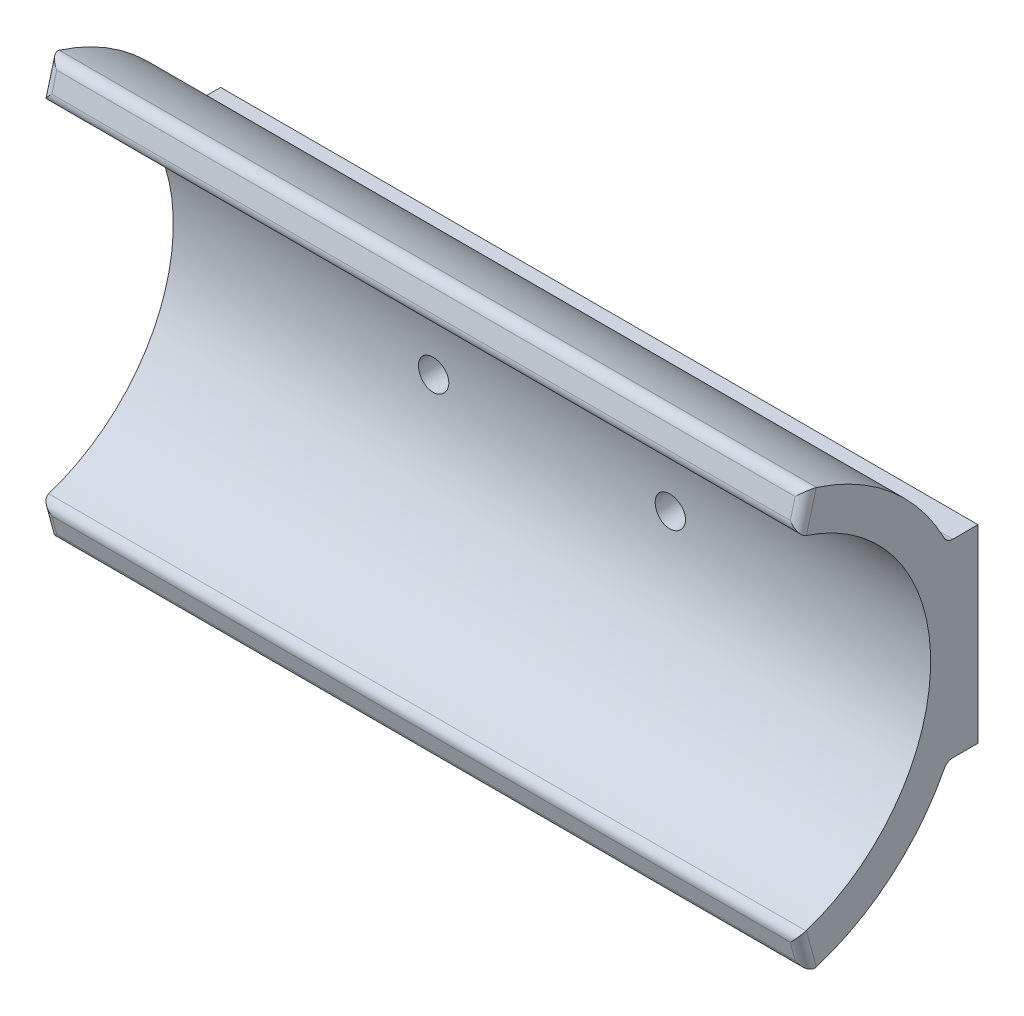
ISO-10303-21;
HEADER;
FILE_DESCRIPTION(('STEP AP214'),'2;1');
FILE_NAME('part.step','',(''),(''),'','','');
FILE_SCHEMA(('AUTOMOTIVE_DESIGN { 1 0 10303 214 1 1 1 1 }'));
ENDSEC;
DATA;
#1=APPLICATION_CONTEXT('core data for automotive mechanical design processes');
#2=APPLICATION_PROTOCOL_DEFINITION('international standard','automotive_design',2000,#1);
#3=PRODUCT_CONTEXT('',#1,'mechanical');
#4=PRODUCT('Part','Part','',(#3));
#5=PRODUCT_RELATED_PRODUCT_CATEGORY('part','',(#4));
#6=PRODUCT_DEFINITION_FORMATION('','',#4);
#7=PRODUCT_DEFINITION_CONTEXT('part definition',#1,'design');
#8=PRODUCT_DEFINITION('design','',#6,#7);
#9=PRODUCT_DEFINITION_SHAPE('','',#8);
#10=(LENGTH_UNIT() NAMED_UNIT(*) SI_UNIT(.MILLI.,.METRE.));
#11=(NAMED_UNIT(*) PLANE_ANGLE_UNIT() SI_UNIT($,.RADIAN.));
#12=(NAMED_UNIT(*) SI_UNIT($,.STERADIAN.) SOLID_ANGLE_UNIT());
#13=UNCERTAINTY_MEASURE_WITH_UNIT(LENGTH_MEASURE(1.E-05),#10,'distance_accuracy_value','');
#14=(GEOMETRIC_REPRESENTATION_CONTEXT(3) GLOBAL_UNCERTAINTY_ASSIGNED_CONTEXT((#13)) GLOBAL_UNIT_ASSIGNED_CONTEXT((#10,
#11,#12)) REPRESENTATION_CONTEXT('',''));
#15=CARTESIAN_POINT('',(0.,0.,0.));
#16=DIRECTION('',(0.,0.,1.));
#17=DIRECTION('',(1.,0.,0.));
#18=AXIS2_PLACEMENT_3D('',#15,#16,#17);
#19=CARTESIAN_POINT('',(40.,0.,0.));
#20=DIRECTION('',(-1.,0.,0.));
#21=DIRECTION('',(0.,0.,1.));
#22=AXIS2_PLACEMENT_3D('',#19,#20,#21);
#23=CYLINDRICAL_SURFACE('',#22,19.);
#24=CARTESIAN_POINT('',(-14.1,0.,-19.));
#25=CARTESIAN_POINT('',(-14.0999960835415,0.0897022201628079,-18.9999991180376));
#26=CARTESIAN_POINT('',(-14.0924310417876,0.17946542118437,-18.9993579799411));
#27=CARTESIAN_POINT('',(-14.062364118635,0.356508015860384,-18.9968619968672));
#28=CARTESIAN_POINT('',(-14.0398453372965,0.443784482616437,-18.9950057787034));
#29=CARTESIAN_POINT('',(-13.9805269531569,0.613263876432167,-18.9902893862354));
#30=CARTESIAN_POINT('',(-13.9437354570041,0.695469652889491,-18.9874297819246));
#31=CARTESIAN_POINT('',(-13.8569305817379,0.852519280905819,-18.9810272614847));
#32=CARTESIAN_POINT('',(-13.8069200212426,0.927364697205886,-18.9774844910664));
#33=CARTESIAN_POINT('',(-13.694956297622,1.06778314835982,-18.9701028517491));
#34=CARTESIAN_POINT('',(-13.6329758716362,1.13333441200539,-18.9662633191453));
#35=CARTESIAN_POINT('',(-13.4988894451914,1.25311698514063,-18.9587264598766));
#36=CARTESIAN_POINT('',(-13.4267829990441,1.30734779610871,-18.9550291394802));
#37=CARTESIAN_POINT('',(-13.2743593194736,1.4030239180965,-18.9481882068375));
#38=CARTESIAN_POINT('',(-13.1940300165727,1.44445006562922,-18.945045427506));
#39=CARTESIAN_POINT('',(-13.0275249701652,1.51321851188047,-18.9396770420494));
#40=CARTESIAN_POINT('',(-12.9413493319264,1.5405610641091,-18.9374514194152));
#41=CARTESIAN_POINT('',(-12.7658161651597,1.5803229462556,-18.9341749382671));
#42=CARTESIAN_POINT('',(-12.6764667317365,1.59277777884827,-18.9331212853813));
#43=CARTESIAN_POINT('',(-12.4969398154057,1.60252035582066,-18.9322992173065));
#44=CARTESIAN_POINT('',(-12.4067623483701,1.59980839031896,-18.9325307775332));
#45=CARTESIAN_POINT('',(-12.2283825401598,1.57932369237232,-18.9342504325839));
#46=CARTESIAN_POINT('',(-12.140175731652,1.56158955316633,-18.9357353075014));
#47=CARTESIAN_POINT('',(-11.9679951319775,1.51162387767854,-18.9397892330275));
#48=CARTESIAN_POINT('',(-11.8840213829297,1.47939219717754,-18.9423582944214));
#49=CARTESIAN_POINT('',(-11.7225676731866,1.40130319713967,-18.9482948277938));
#50=CARTESIAN_POINT('',(-11.6450961213911,1.35542857182675,-18.9516633127206));
#51=CARTESIAN_POINT('',(-11.498937900689,1.25136836863842,-18.9588182157182));
#52=CARTESIAN_POINT('',(-11.4302514135627,1.19318253608593,-18.9626046424339));
#53=CARTESIAN_POINT('',(-11.3033886861831,1.06593518539138,-18.970183115644));
#54=CARTESIAN_POINT('',(-11.2452459034404,0.996840304475862,-18.9739751428185));
#55=CARTESIAN_POINT('',(-11.1413797628512,0.849852575218629,-18.9811262983821));
#56=CARTESIAN_POINT('',(-11.0956564135354,0.771959720833711,-18.9844854264737));
#57=CARTESIAN_POINT('',(-11.0179291052771,0.609565321587298,-18.9903929611599));
#58=CARTESIAN_POINT('',(-10.9859266385501,0.525063059100258,-18.9929412795669));
#59=CARTESIAN_POINT('',(-10.936573006044,0.351858580781858,-18.9969390629498));
#60=CARTESIAN_POINT('',(-10.9192215297571,0.263156454003024,-18.9983885512137));
#61=CARTESIAN_POINT('',(-10.8997043948967,0.0843601672939649,-19.0000223666535));
#62=CARTESIAN_POINT('',(-10.8974925249959,-0.00572891460424725,-19.0002105437517));
#63=CARTESIAN_POINT('',(-10.9081963170893,-0.184996611802441,-18.9993108186761));
#64=CARTESIAN_POINT('',(-10.9211118349468,-0.274175235769281,-18.9982229286608));
#65=CARTESIAN_POINT('',(-10.9616654752258,-0.448958720175844,-18.9948958862545));
#66=CARTESIAN_POINT('',(-10.9892821675597,-0.534568587461511,-18.992658409795));
#67=CARTESIAN_POINT('',(-11.0584323252729,-0.699939526801056,-18.9872835295732));
#68=CARTESIAN_POINT('',(-11.099966015183,-0.779700504466144,-18.9841461112917));
#69=CARTESIAN_POINT('',(-11.1958872343935,-0.931319775497864,-18.9773134190734));
#70=CARTESIAN_POINT('',(-11.2503053656597,-1.00315864824649,-18.9736168246983));
#71=CARTESIAN_POINT('',(-11.3704065463115,-1.13669840169253,-18.9660854910945));
#72=CARTESIAN_POINT('',(-11.4360897955621,-1.19839910248105,-18.9622507494158));
#73=CARTESIAN_POINT('',(-11.5770572867,-1.31006966029436,-18.9548639157849));
#74=CARTESIAN_POINT('',(-11.6523654680129,-1.36000935323234,-18.9513125657427));
#75=CARTESIAN_POINT('',(-11.8103259897862,-1.44653343925829,-18.9449051553316));
#76=CARTESIAN_POINT('',(-11.8929782555805,-1.4831179681064,-18.9420490878951));
#77=CARTESIAN_POINT('',(-12.0631741067308,-1.54184188665984,-18.9373598021952));
#78=CARTESIAN_POINT('',(-12.1507112921072,-1.56399971653277,-18.9355252786332));
#79=CARTESIAN_POINT('',(-12.3282797035461,-1.59330128549475,-18.9330824380073));
#80=CARTESIAN_POINT('',(-12.4183108805499,-1.60044531970356,-18.9324740968409));
#81=CARTESIAN_POINT('',(-12.5980118464511,-1.5995130622002,-18.9325528588707));
#82=CARTESIAN_POINT('',(-12.6876818867947,-1.59148416449903,-18.9332359282333));
#83=CARTESIAN_POINT('',(-12.8643951195662,-1.56053280548196,-18.9358119741465));
#84=CARTESIAN_POINT('',(-12.9514383080313,-1.53761032169955,-18.9377049525223));
#85=CARTESIAN_POINT('',(-13.12042992173,-1.47753453353146,-18.9424864607053));
#86=CARTESIAN_POINT('',(-13.2023786619154,-1.44038210989616,-18.9453749288963));
#87=CARTESIAN_POINT('',(-13.3588835068667,-1.35290635360476,-18.9518220594399));
#88=CARTESIAN_POINT('',(-13.4334397240235,-1.30258322122926,-18.9553807116011));
#89=CARTESIAN_POINT('',(-13.5732857097509,-1.19001644712862,-18.962780463069));
#90=CARTESIAN_POINT('',(-13.6385471784027,-1.12773770067982,-18.9666223731065));
#91=CARTESIAN_POINT('',(-13.7577172197081,-0.993091602740383,-18.9741483499718));
#92=CARTESIAN_POINT('',(-13.8116230428968,-0.920721815007671,-18.9778323784011));
#93=CARTESIAN_POINT('',(-13.9066254714308,-0.767805666415016,-18.9846342821028));
#94=CARTESIAN_POINT('',(-13.9476976448508,-0.687244092157416,-18.987751072851));
#95=CARTESIAN_POINT('',(-14.01567944673,-0.520396683834348,-18.9930546561496));
#96=CARTESIAN_POINT('',(-14.0426053398455,-0.434117552672955,-18.9952425161782));
#97=CARTESIAN_POINT('',(-14.0746796887795,-0.289442019464114,-18.9978806442406));
#98=CARTESIAN_POINT('',(-14.0841621680597,-0.231975786172761,-18.9986717803291));
#99=CARTESIAN_POINT('',(-14.0968235853339,-0.116348253634203,-18.9997317435485));
#100=CARTESIAN_POINT('',(-14.1000025404812,-0.0581869562788527,-19.0000005721007));
#101=CARTESIAN_POINT('',(-14.1,0.,-19.));
#102=B_SPLINE_CURVE_WITH_KNOTS('',3,(#24,#25,#26,#27,#28,#29,#30,#31,#32,#33,#34,#35,#36,#37,
#38,#39,#40,#41,#42,#43,#44,#45,#46,#47,#48,#49,#50,#51,#52,#53,#54,#55,#56,#57,#58,#59,#60,#61,
#62,#63,#64,#65,#66,#67,#68,#69,#70,#71,#72,#73,#74,#75,#76,#77,#78,#79,#80,#81,#82,#83,#84,#85,
#86,#87,#88,#89,#90,#91,#92,#93,#94,#95,#96,#97,#98,#99,#100,#101),.UNSPECIFIED.,.T.,.F.,(4,2,2,
2,2,2,2,2,2,2,2,2,2,2,2,2,2,2,2,2,2,2,2,2,2,2,2,2,2,2,2,2,2,2,2,2,2,2,4),(0.,0.268894212981357,
0.538092834600205,0.807138779523793,1.07612740368338,1.34573606657737,1.61535659979132,
1.88537871545866,2.15539597045471,2.42476802372581,2.69413492432251,2.96281189001966,
3.23149152853093,3.50051344558683,3.76954092833671,4.03940770104721,4.30927465912648,
4.57917095916441,4.84906153897149,5.1181279503389,5.38719179800878,5.6558644976541,
5.92454153215865,6.19386322138191,6.46318968938944,6.73319956851791,7.00320670282028,
7.27286803365094,7.54252406381478,7.81133919118259,8.08015472405038,8.34895362149057,
8.61774843167324,8.88734490952067,9.15700658808931,9.427178547794,9.69703919428247,
9.871462729873,10.0458857908183),.UNSPECIFIED.);
#103=CARTESIAN_POINT('',(-14.1,0.,-19.));
#104=VERTEX_POINT('',#103);
#105=EDGE_CURVE('E217',#104,#104,#102,.T.);
#106=ORIENTED_EDGE('',*,*,#105,.T.);
#107=EDGE_LOOP('',(#106));
#108=FACE_BOUND('',#107,.T.);
#109=CARTESIAN_POINT('',(10.9,0.,-19.));
#110=CARTESIAN_POINT('',(10.9000039164585,0.0897022201628079,-18.9999991180376));
#111=CARTESIAN_POINT('',(10.9075689582124,0.17946542118437,-18.9993579799411));
#112=CARTESIAN_POINT('',(10.937635881365,0.356508015860384,-18.9968619968672));
#113=CARTESIAN_POINT('',(10.9601546627035,0.443784482616437,-18.9950057787034));
#114=CARTESIAN_POINT('',(11.0194730468431,0.613263876432167,-18.9902893862354));
#115=CARTESIAN_POINT('',(11.0562645429959,0.695469652889491,-18.9874297819246));
#116=CARTESIAN_POINT('',(11.1430694182621,0.852519280905819,-18.9810272614847));
#117=CARTESIAN_POINT('',(11.1930799787574,0.927364697205886,-18.9774844910664));
#118=CARTESIAN_POINT('',(11.305043702378,1.06778314835982,-18.9701028517491));
#119=CARTESIAN_POINT('',(11.3670241283638,1.13333441200539,-18.9662633191453));
#120=CARTESIAN_POINT('',(11.5011105548086,1.25311698514063,-18.9587264598766));
#121=CARTESIAN_POINT('',(11.5732170009559,1.30734779610871,-18.9550291394802));
#122=CARTESIAN_POINT('',(11.7256406805264,1.4030239180965,-18.9481882068375));
#123=CARTESIAN_POINT('',(11.8059699834273,1.44445006562922,-18.945045427506));
#124=CARTESIAN_POINT('',(11.9724750298348,1.51321851188047,-18.9396770420494));
#125=CARTESIAN_POINT('',(12.0586506680736,1.5405610641091,-18.9374514194152));
#126=CARTESIAN_POINT('',(12.2341838348403,1.5803229462556,-18.9341749382671));
#127=CARTESIAN_POINT('',(12.3235332682635,1.59277777884827,-18.9331212853813));
#128=CARTESIAN_POINT('',(12.5030601845943,1.60252035582066,-18.9322992173065));
#129=CARTESIAN_POINT('',(12.5932376516299,1.59980839031896,-18.9325307775332));
#130=CARTESIAN_POINT('',(12.7716174598402,1.57932369237232,-18.9342504325839));
#131=CARTESIAN_POINT('',(12.859824268348,1.56158955316633,-18.9357353075014));
#132=CARTESIAN_POINT('',(13.0320048680225,1.51162387767854,-18.9397892330275));
#133=CARTESIAN_POINT('',(13.1159786170703,1.47939219717754,-18.9423582944214));
#134=CARTESIAN_POINT('',(13.2774323268134,1.40130319713967,-18.9482948277938));
#135=CARTESIAN_POINT('',(13.3549038786089,1.35542857182675,-18.9516633127206));
#136=CARTESIAN_POINT('',(13.501062099311,1.25136836863841,-18.9588182157182));
#137=CARTESIAN_POINT('',(13.5697485864373,1.19318253608593,-18.9626046424339));
#138=CARTESIAN_POINT('',(13.6966113138169,1.06593518539138,-18.970183115644));
#139=CARTESIAN_POINT('',(13.7547540965596,0.996840304475862,-18.9739751428185));
#140=CARTESIAN_POINT('',(13.8586202371489,0.849852575218629,-18.9811262983821));
#141=CARTESIAN_POINT('',(13.9043435864646,0.771959720833711,-18.9844854264737));
#142=CARTESIAN_POINT('',(13.9820708947229,0.609565321587298,-18.9903929611599));
#143=CARTESIAN_POINT('',(14.0140733614499,0.525063059100258,-18.9929412795669));
#144=CARTESIAN_POINT('',(14.063426993956,0.351858580781858,-18.9969390629498));
#145=CARTESIAN_POINT('',(14.0807784702429,0.263156454003024,-18.9983885512137));
#146=CARTESIAN_POINT('',(14.1002956051033,0.0843601672939649,-19.0000223666535));
#147=CARTESIAN_POINT('',(14.1025074750041,-0.00572891460424725,-19.0002105437517));
#148=CARTESIAN_POINT('',(14.0918036829107,-0.184996611802441,-18.9993108186761));
#149=CARTESIAN_POINT('',(14.0788881650532,-0.274175235769281,-18.9982229286608));
#150=CARTESIAN_POINT('',(14.0383345247742,-0.448958720175844,-18.9948958862545));
#151=CARTESIAN_POINT('',(14.0107178324403,-0.534568587461511,-18.992658409795));
#152=CARTESIAN_POINT('',(13.9415676747271,-0.699939526801056,-18.9872835295732));
#153=CARTESIAN_POINT('',(13.900033984817,-0.779700504466144,-18.9841461112917));
#154=CARTESIAN_POINT('',(13.8041127656065,-0.931319775497864,-18.9773134190734));
#155=CARTESIAN_POINT('',(13.7496946343403,-1.00315864824649,-18.9736168246983));
#156=CARTESIAN_POINT('',(13.6295934536885,-1.13669840169253,-18.9660854910945));
#157=CARTESIAN_POINT('',(13.5639102044379,-1.19839910248105,-18.9622507494158));
#158=CARTESIAN_POINT('',(13.4229427133,-1.31006966029436,-18.9548639157849));
#159=CARTESIAN_POINT('',(13.3476345319871,-1.36000935323234,-18.9513125657427));
#160=CARTESIAN_POINT('',(13.1896740102138,-1.44653343925829,-18.9449051553316));
#161=CARTESIAN_POINT('',(13.1070217444195,-1.4831179681064,-18.9420490878951));
#162=CARTESIAN_POINT('',(12.9368258932692,-1.54184188665984,-18.9373598021952));
#163=CARTESIAN_POINT('',(12.8492887078928,-1.56399971653277,-18.9355252786332));
#164=CARTESIAN_POINT('',(12.6717202964539,-1.59330128549475,-18.9330824380073));
#165=CARTESIAN_POINT('',(12.5816891194501,-1.60044531970356,-18.9324740968409));
#166=CARTESIAN_POINT('',(12.401988153549,-1.5995130622002,-18.9325528588707));
#167=CARTESIAN_POINT('',(12.3123181132053,-1.59148416449903,-18.9332359282333));
#168=CARTESIAN_POINT('',(12.1356048804338,-1.56053280548196,-18.9358119741465));
#169=CARTESIAN_POINT('',(12.0485616919687,-1.53761032169955,-18.9377049525223));
#170=CARTESIAN_POINT('',(11.87957007827,-1.47753453353146,-18.9424864607053));
#171=CARTESIAN_POINT('',(11.7976213380846,-1.44038210989616,-18.9453749288963));
#172=CARTESIAN_POINT('',(11.6411164931333,-1.35290635360476,-18.9518220594399));
#173=CARTESIAN_POINT('',(11.5665602759765,-1.30258322122926,-18.9553807116011));
#174=CARTESIAN_POINT('',(11.4267142902491,-1.19001644712862,-18.962780463069));
#175=CARTESIAN_POINT('',(11.3614528215973,-1.12773770067982,-18.9666223731065));
#176=CARTESIAN_POINT('',(11.2422827802919,-0.993091602740381,-18.9741483499718));
#177=CARTESIAN_POINT('',(11.1883769571032,-0.92072181500767,-18.9778323784011));
#178=CARTESIAN_POINT('',(11.0933745285692,-0.767805666415016,-18.9846342821028));
#179=CARTESIAN_POINT('',(11.0523023551492,-0.687244092157416,-18.987751072851));
#180=CARTESIAN_POINT('',(10.98432055327,-0.520396683834348,-18.9930546561496));
#181=CARTESIAN_POINT('',(10.9573946601545,-0.434117552672955,-18.9952425161782));
#182=CARTESIAN_POINT('',(10.9253203112205,-0.289442019464114,-18.9978806442406));
#183=CARTESIAN_POINT('',(10.9158378319403,-0.231975786172761,-18.9986717803291));
#184=CARTESIAN_POINT('',(10.9031764146661,-0.116348253634203,-18.9997317435485));
#185=CARTESIAN_POINT('',(10.8999974595188,-0.0581869562788527,-19.0000005721007));
#186=CARTESIAN_POINT('',(10.9,0.,-19.));
#187=B_SPLINE_CURVE_WITH_KNOTS('',3,(#109,#110,#111,#112,#113,#114,#115,#116,#117,#118,#119,
#120,#121,#122,#123,#124,#125,#126,#127,#128,#129,#130,#131,#132,#133,#134,#135,#136,#137,#138,
#139,#140,#141,#142,#143,#144,#145,#146,#147,#148,#149,#150,#151,#152,#153,#154,#155,#156,#157,
#158,#159,#160,#161,#162,#163,#164,#165,#166,#167,#168,#169,#170,#171,#172,#173,#174,#175,#176,
#177,#178,#179,#180,#181,#182,#183,#184,#185,#186),.UNSPECIFIED.,.T.,.F.,(4,2,2,2,2,2,2,2,2,2,2,
2,2,2,2,2,2,2,2,2,2,2,2,2,2,2,2,2,2,2,2,2,2,2,2,2,2,2,4),(0.,0.268894212981357,
0.538092834600205,0.807138779523793,1.07612740368338,1.34573606657737,1.61535659979132,
1.88537871545866,2.15539597045471,2.42476802372581,2.69413492432251,2.96281189001966,
3.23149152853093,3.50051344558684,3.76954092833671,4.0394077010472,4.30927465912647,
4.57917095916441,4.84906153897149,5.1181279503389,5.38719179800878,5.6558644976541,
5.92454153215865,6.19386322138191,6.46318968938944,6.73319956851791,7.00320670282028,
7.27286803365094,7.54252406381478,7.81133919118259,8.08015472405038,8.34895362149057,
8.61774843167324,8.88734490952068,9.15700658808931,9.427178547794,9.69703919428247,
9.871462729873,10.0458857908183),.UNSPECIFIED.);
#188=CARTESIAN_POINT('',(10.9,0.,-19.));
#189=VERTEX_POINT('',#188);
#190=EDGE_CURVE('E241',#189,#189,#187,.T.);
#191=ORIENTED_EDGE('',*,*,#190,.T.);
#192=EDGE_LOOP('',(#191));
#193=FACE_BOUND('',#192,.T.);
#194=CARTESIAN_POINT('',(40.,0.,0.));
#195=DIRECTION('',(-1.,0.,0.));
#196=DIRECTION('',(0.,0.,-1.));
#197=AXIS2_PLACEMENT_3D('',#194,#195,#196);
#198=CIRCLE('',#197,19.);
#199=CARTESIAN_POINT('',(40.,18.0683349260191,-5.87667193241183));
#200=VERTEX_POINT('',#199);
#201=CARTESIAN_POINT('',(40.,-18.0683349260191,-5.87667193241183));
#202=VERTEX_POINT('',#201);
#203=EDGE_CURVE('E234',#200,#202,#198,.T.);
#204=ORIENTED_EDGE('',*,*,#203,.F.);
#205=CARTESIAN_POINT('',(40.,18.0683349260191,-5.87667193241183));
#206=CARTESIAN_POINT('',(39.9999999818442,18.070917420485,-5.86873180814752));
#207=CARTESIAN_POINT('',(39.999895740914,18.0734938832462,-5.86079246772656));
#208=CARTESIAN_POINT('',(39.9994788135046,18.0786347453593,-5.84491535457135));
#209=CARTESIAN_POINT('',(39.9991661270255,18.0811991447113,-5.83697758183709));
#210=CARTESIAN_POINT('',(39.9987492177719,18.0837575123586,-5.82904059294618));
#211=B_SPLINE_CURVE_WITH_KNOTS('',3,(#205,#206,#207,#208,#209,#210),.UNSPECIFIED.,.F.,.F.,(4,2,
4),(0.,0.025042750960332,0.0500855019206634),.UNSPECIFIED.);
#212=CARTESIAN_POINT('',(39.9987492177719,18.0837575123586,-5.82904059294618));
#213=VERTEX_POINT('',#212);
#214=EDGE_CURVE('E357',#200,#213,#211,.T.);
#215=ORIENTED_EDGE('',*,*,#214,.T.);
#216=DIRECTION('',(-1.,0.,0.));
#217=VECTOR('',#216,1.);
#218=CARTESIAN_POINT('',(40.,18.0837575123586,-5.82904059294618));
#219=LINE('',#218,#217);
#220=CARTESIAN_POINT('',(-39.9987492177719,18.0837575123586,-5.82904059294618));
#221=VERTEX_POINT('',#220);
#222=EDGE_CURVE('E345',#213,#221,#219,.T.);
#223=ORIENTED_EDGE('',*,*,#222,.T.);
#224=CARTESIAN_POINT('',(-39.9987492177719,18.0837575123586,-5.82904059294618));
#225=CARTESIAN_POINT('',(-39.9991661270255,18.0811991447113,-5.83697758183709));
#226=CARTESIAN_POINT('',(-39.9994788135046,18.0786347453593,-5.84491535457135));
#227=CARTESIAN_POINT('',(-39.999895740914,18.0734938832462,-5.86079246772656));
#228=CARTESIAN_POINT('',(-39.9999999818442,18.070917420485,-5.86873180814752));
#229=CARTESIAN_POINT('',(-40.,18.0683349260191,-5.87667193241183));
#230=B_SPLINE_CURVE_WITH_KNOTS('',3,(#224,#225,#226,#227,#228,#229),.UNSPECIFIED.,.F.,.F.,(4,2,
4),(0.,0.0250427509603311,0.0500855019206631),.UNSPECIFIED.);
#231=CARTESIAN_POINT('',(-40.,18.0683349260191,-5.87667193241183));
#232=VERTEX_POINT('',#231);
#233=EDGE_CURVE('E338',#221,#232,#230,.T.);
#234=ORIENTED_EDGE('',*,*,#233,.T.);
#235=CARTESIAN_POINT('',(-40.,0.,0.));
#236=DIRECTION('',(-1.,0.,0.));
#237=DIRECTION('',(0.,0.,-1.));
#238=AXIS2_PLACEMENT_3D('',#235,#236,#237);
#239=CIRCLE('',#238,19.);
#240=CARTESIAN_POINT('',(-40.,-18.0683349260191,-5.87667193241183));
#241=VERTEX_POINT('',#240);
#242=EDGE_CURVE('E212',#232,#241,#239,.T.);
#243=ORIENTED_EDGE('',*,*,#242,.T.);
#244=CARTESIAN_POINT('',(-40.,-18.0683349260191,-5.87667193241183));
#245=CARTESIAN_POINT('',(-39.9999999818442,-18.070917420485,-5.86873180814753));
#246=CARTESIAN_POINT('',(-39.999895740914,-18.0734938832462,-5.86079246772657));
#247=CARTESIAN_POINT('',(-39.9994788135046,-18.0786347453593,-5.84491535457136));
#248=CARTESIAN_POINT('',(-39.9991661270255,-18.0811991447113,-5.8369775818371));
#249=CARTESIAN_POINT('',(-39.9987492177719,-18.0837575123586,-5.82904059294619));
#250=B_SPLINE_CURVE_WITH_KNOTS('',3,(#244,#245,#246,#247,#248,#249),.UNSPECIFIED.,.F.,.F.,(4,2,
4),(0.,0.0250427509603323,0.0500855019206642),.UNSPECIFIED.);
#251=CARTESIAN_POINT('',(-39.9987492177719,-18.0837575123586,-5.82904059294619));
#252=VERTEX_POINT('',#251);
#253=EDGE_CURVE('E291',#241,#252,#250,.T.);
#254=ORIENTED_EDGE('',*,*,#253,.T.);
#255=DIRECTION('',(-1.,0.,0.));
#256=VECTOR('',#255,1.);
#257=CARTESIAN_POINT('',(40.,-18.0837575123586,-5.82904059294619));
#258=LINE('',#257,#256);
#259=CARTESIAN_POINT('',(39.9987492177719,-18.0837575123586,-5.82904059294619));
#260=VERTEX_POINT('',#259);
#261=EDGE_CURVE('E300',#252,#260,#258,.F.);
#262=ORIENTED_EDGE('',*,*,#261,.T.);
#263=CARTESIAN_POINT('',(39.9987492177719,-18.0837575123586,-5.82904059294619));
#264=CARTESIAN_POINT('',(39.9991661270255,-18.0811991447113,-5.8369775818371));
#265=CARTESIAN_POINT('',(39.9994788135046,-18.0786347453593,-5.84491535457136));
#266=CARTESIAN_POINT('',(39.999895740914,-18.0734938832462,-5.86079246772657));
#267=CARTESIAN_POINT('',(39.9999999818442,-18.070917420485,-5.86873180814753));
#268=CARTESIAN_POINT('',(40.,-18.0683349260191,-5.87667193241183));
#269=B_SPLINE_CURVE_WITH_KNOTS('',3,(#263,#264,#265,#266,#267,#268),.UNSPECIFIED.,.F.,.F.,(4,2,
4),(0.,0.0250427509603319,0.050085501920664),.UNSPECIFIED.);
#270=EDGE_CURVE('E332',#260,#202,#269,.T.);
#271=ORIENTED_EDGE('',*,*,#270,.T.);
#272=EDGE_LOOP('',(#204,#215,#223,#234,#243,#254,#262,#271));
#273=FACE_BOUND('',#272,.T.);
#274=ADVANCED_FACE('F46',(#108,#193,#273),#23,.F.);
#275=CARTESIAN_POINT('',(40.,-18.3525906994923,-4.91756185694778));
#276=DIRECTION('',(0.,0.258819045102515,-0.96592582628907));
#277=DIRECTION('',(0.,0.96592582628907,0.258819045102515));
#278=AXIS2_PLACEMENT_3D('',#275,#276,#277);
#279=PLANE('',#278);
#280=DIRECTION('',(0.,-0.96592582628907,-0.258819045102515));
#281=VECTOR('',#280,1.);
#282=CARTESIAN_POINT('',(39.,-18.3525906994923,-4.91756185694778));
#283=LINE('',#282,#281);
#284=CARTESIAN_POINT('',(39.,-21.2284039676548,-5.68813369973461));
#285=VERTEX_POINT('',#284);
#286=CARTESIAN_POINT('',(39.,-19.2943532686379,-5.16990637681218));
#287=VERTEX_POINT('',#286);
#288=EDGE_CURVE('E64',#285,#287,#283,.F.);
#289=ORIENTED_EDGE('',*,*,#288,.T.);
#290=DIRECTION('',(-1.,0.,0.));
#291=VECTOR('',#290,1.);
#292=CARTESIAN_POINT('',(40.,-19.2943532686379,-5.16990637681218));
#293=LINE('',#292,#291);
#294=CARTESIAN_POINT('',(-39.,-19.2943532686379,-5.16990637681218));
#295=VERTEX_POINT('',#294);
#296=EDGE_CURVE('E371',#287,#295,#293,.T.);
#297=ORIENTED_EDGE('',*,*,#296,.T.);
#298=DIRECTION('',(0.,-0.96592582628907,-0.258819045102515));
#299=VECTOR('',#298,1.);
#300=CARTESIAN_POINT('',(-39.,-18.3525906994923,-4.91756185694778));
#301=LINE('',#300,#299);
#302=CARTESIAN_POINT('',(-39.,-21.2284039676548,-5.68813369973461));
#303=VERTEX_POINT('',#302);
#304=EDGE_CURVE('E364',#295,#303,#301,.T.);
#305=ORIENTED_EDGE('',*,*,#304,.T.);
#306=DIRECTION('',(-1.,0.,0.));
#307=VECTOR('',#306,1.);
#308=CARTESIAN_POINT('',(40.,-21.2284039676548,-5.68813369973461));
#309=LINE('',#308,#307);
#310=EDGE_CURVE('E69',#303,#285,#309,.F.);
#311=ORIENTED_EDGE('',*,*,#310,.T.);
#312=EDGE_LOOP('',(#289,#297,#305,#311));
#313=FACE_BOUND('',#312,.T.);
#314=ADVANCED_FACE('F310',(#313),#279,.F.);
#315=CARTESIAN_POINT('',(40.,0.,0.));
#316=DIRECTION('',(-1.,0.,0.));
#317=DIRECTION('',(0.,0.,1.));
#318=AXIS2_PLACEMENT_3D('',#315,#316,#317);
#319=CYLINDRICAL_SURFACE('',#318,23.);
#320=CARTESIAN_POINT('',(40.,0.,0.));
#321=DIRECTION('',(1.,0.,0.));
#322=DIRECTION('',(0.,0.,-1.));
#323=AXIS2_PLACEMENT_3D('',#320,#321,#322);
#324=CIRCLE('',#323,23.);
#325=CARTESIAN_POINT('',(40.,-21.9227478735774,-6.95651677720657));
#326=VERTEX_POINT('',#325);
#327=CARTESIAN_POINT('',(40.,-10.5416666666667,-20.4419486323806));
#328=VERTEX_POINT('',#327);
#329=EDGE_CURVE('E186',#326,#328,#324,.T.);
#330=ORIENTED_EDGE('',*,*,#329,.F.);
#331=DIRECTION('',(-1.,0.,0.));
#332=VECTOR('',#331,1.);
#333=CARTESIAN_POINT('',(40.,-21.9227478735774,-6.95651677720657));
#334=LINE('',#333,#332);
#335=CARTESIAN_POINT('',(-40.,-21.9227478735774,-6.95651677720657));
#336=VERTEX_POINT('',#335);
#337=EDGE_CURVE('E377',#326,#336,#334,.T.);
#338=ORIENTED_EDGE('',*,*,#337,.T.);
#339=CARTESIAN_POINT('',(-40.,0.,0.));
#340=DIRECTION('',(1.,0.,0.));
#341=DIRECTION('',(0.,0.,-1.));
#342=AXIS2_PLACEMENT_3D('',#339,#340,#341);
#343=CIRCLE('',#342,23.);
#344=CARTESIAN_POINT('',(-40.,-10.5416666666667,-20.4419486323806));
#345=VERTEX_POINT('',#344);
#346=EDGE_CURVE('E216',#336,#345,#343,.T.);
#347=ORIENTED_EDGE('',*,*,#346,.T.);
#348=DIRECTION('',(-1.,0.,0.));
#349=VECTOR('',#348,1.);
#350=CARTESIAN_POINT('',(40.,-10.5416666666667,-20.4419486323806));
#351=LINE('',#350,#349);
#352=EDGE_CURVE('E374',#345,#328,#351,.F.);
#353=ORIENTED_EDGE('',*,*,#352,.T.);
#354=EDGE_LOOP('',(#330,#338,#347,#353));
#355=FACE_BOUND('',#354,.T.);
#356=ADVANCED_FACE('F434',(#355),#319,.T.);
#357=CARTESIAN_POINT('',(40.,-10.,-20.712315177208));
#358=DIRECTION('',(0.,1.,0.));
#359=DIRECTION('',(0.,0.,1.));
#360=AXIS2_PLACEMENT_3D('',#357,#358,#359);
#361=PLANE('',#360);
#362=DIRECTION('',(0.,0.,-1.));
#363=VECTOR('',#362,1.);
#364=CARTESIAN_POINT('',(40.,-10.,-20.712315177208));
#365=LINE('',#364,#363);
#366=CARTESIAN_POINT('',(40.,-10.,-21.3307290077015));
#367=VERTEX_POINT('',#366);
#368=CARTESIAN_POINT('',(40.,-10.,-24.));
#369=VERTEX_POINT('',#368);
#370=EDGE_CURVE('E172',#367,#369,#365,.T.);
#371=ORIENTED_EDGE('',*,*,#370,.F.);
#372=DIRECTION('',(1.,0.,0.));
#373=VECTOR('',#372,1.);
#374=CARTESIAN_POINT('',(-40.,-10.,-21.3307290077015));
#375=LINE('',#374,#373);
#376=CARTESIAN_POINT('',(-40.,-10.,-21.3307290077015));
#377=VERTEX_POINT('',#376);
#378=EDGE_CURVE('E383',#367,#377,#375,.F.);
#379=ORIENTED_EDGE('',*,*,#378,.T.);
#380=DIRECTION('',(0.,0.,-1.));
#381=VECTOR('',#380,1.);
#382=CARTESIAN_POINT('',(-40.,-10.,-20.712315177208));
#383=LINE('',#382,#381);
#384=CARTESIAN_POINT('',(-40.,-10.,-24.));
#385=VERTEX_POINT('',#384);
#386=EDGE_CURVE('E192',#377,#385,#383,.T.);
#387=ORIENTED_EDGE('',*,*,#386,.T.);
#388=DIRECTION('',(-1.,0.,0.));
#389=VECTOR('',#388,1.);
#390=CARTESIAN_POINT('',(40.,-10.,-24.));
#391=LINE('',#390,#389);
#392=EDGE_CURVE('E189',#369,#385,#391,.T.);
#393=ORIENTED_EDGE('',*,*,#392,.F.);
#394=EDGE_LOOP('',(#371,#379,#387,#393));
#395=FACE_BOUND('',#394,.T.);
#396=ADVANCED_FACE('F190',(#395),#361,.F.);
#397=CARTESIAN_POINT('',(40.,-10.,-24.));
#398=DIRECTION('',(0.,0.,1.));
#399=DIRECTION('',(1.,0.,0.));
#400=AXIS2_PLACEMENT_3D('',#397,#398,#399);
#401=PLANE('',#400);
#402=CARTESIAN_POINT('',(-12.5,0.,-24.));
#403=DIRECTION('',(0.,0.,1.));
#404=DIRECTION('',(1.,0.,0.));
#405=AXIS2_PLACEMENT_3D('',#402,#403,#404);
#406=CIRCLE('',#405,1.6);
#407=CARTESIAN_POINT('',(-10.9,0.,-24.));
#408=VERTEX_POINT('',#407);
#409=EDGE_CURVE('E243',#408,#408,#406,.T.);
#410=ORIENTED_EDGE('',*,*,#409,.T.);
#411=EDGE_LOOP('',(#410));
#412=FACE_BOUND('',#411,.T.);
#413=CARTESIAN_POINT('',(12.5,0.,-24.));
#414=DIRECTION('',(0.,0.,1.));
#415=DIRECTION('',(1.,0.,0.));
#416=AXIS2_PLACEMENT_3D('',#413,#414,#415);
#417=CIRCLE('',#416,1.6);
#418=CARTESIAN_POINT('',(14.1,0.,-24.));
#419=VERTEX_POINT('',#418);
#420=EDGE_CURVE('E237',#419,#419,#417,.T.);
#421=ORIENTED_EDGE('',*,*,#420,.T.);
#422=EDGE_LOOP('',(#421));
#423=FACE_BOUND('',#422,.T.);
#424=DIRECTION('',(0.,1.,0.));
#425=VECTOR('',#424,1.);
#426=CARTESIAN_POINT('',(-40.,-10.,-24.));
#427=LINE('',#426,#425);
#428=CARTESIAN_POINT('',(-40.,10.,-24.));
#429=VERTEX_POINT('',#428);
#430=EDGE_CURVE('E223',#385,#429,#427,.T.);
#431=ORIENTED_EDGE('',*,*,#430,.T.);
#432=DIRECTION('',(-1.,0.,0.));
#433=VECTOR('',#432,1.);
#434=CARTESIAN_POINT('',(40.,10.,-24.));
#435=LINE('',#434,#433);
#436=CARTESIAN_POINT('',(40.,10.,-24.));
#437=VERTEX_POINT('',#436);
#438=EDGE_CURVE('E197',#437,#429,#435,.T.);
#439=ORIENTED_EDGE('',*,*,#438,.F.);
#440=DIRECTION('',(0.,1.,0.));
#441=VECTOR('',#440,1.);
#442=CARTESIAN_POINT('',(40.,-10.,-24.));
#443=LINE('',#442,#441);
#444=EDGE_CURVE('E178',#369,#437,#443,.T.);
#445=ORIENTED_EDGE('',*,*,#444,.F.);
#446=ORIENTED_EDGE('',*,*,#392,.T.);
#447=EDGE_LOOP('',(#431,#439,#445,#446));
#448=FACE_BOUND('',#447,.T.);
#449=ADVANCED_FACE('F199',(#412,#423,#448),#401,.F.);
#450=CARTESIAN_POINT('',(40.,10.,-20.712315177208));
#451=DIRECTION('',(0.,-1.,0.));
#452=DIRECTION('',(0.,0.,-1.));
#453=AXIS2_PLACEMENT_3D('',#450,#451,#452);
#454=PLANE('',#453);
#455=DIRECTION('',(0.,0.,1.));
#456=VECTOR('',#455,1.);
#457=CARTESIAN_POINT('',(-40.,10.,-20.712315177208));
#458=LINE('',#457,#456);
#459=CARTESIAN_POINT('',(-40.,10.,-21.3307290077015));
#460=VERTEX_POINT('',#459);
#461=EDGE_CURVE('E226',#429,#460,#458,.T.);
#462=ORIENTED_EDGE('',*,*,#461,.T.);
#463=DIRECTION('',(1.,0.,0.));
#464=VECTOR('',#463,1.);
#465=CARTESIAN_POINT('',(40.,10.,-21.3307290077015));
#466=LINE('',#465,#464);
#467=CARTESIAN_POINT('',(40.,10.,-21.3307290077015));
#468=VERTEX_POINT('',#467);
#469=EDGE_CURVE('E380',#460,#468,#466,.T.);
#470=ORIENTED_EDGE('',*,*,#469,.T.);
#471=DIRECTION('',(0.,0.,1.));
#472=VECTOR('',#471,1.);
#473=CARTESIAN_POINT('',(40.,10.,-20.712315177208));
#474=LINE('',#473,#472);
#475=EDGE_CURVE('E203',#437,#468,#474,.T.);
#476=ORIENTED_EDGE('',*,*,#475,.F.);
#477=ORIENTED_EDGE('',*,*,#438,.T.);
#478=EDGE_LOOP('',(#462,#470,#476,#477));
#479=FACE_BOUND('',#478,.T.);
#480=ADVANCED_FACE('F472',(#479),#454,.F.);
#481=CARTESIAN_POINT('',(40.,0.,0.));
#482=DIRECTION('',(-1.,0.,0.));
#483=DIRECTION('',(0.,0.,1.));
#484=AXIS2_PLACEMENT_3D('',#481,#482,#483);
#485=CYLINDRICAL_SURFACE('',#484,23.);
#486=CARTESIAN_POINT('',(-40.,0.,0.));
#487=DIRECTION('',(1.,0.,0.));
#488=DIRECTION('',(0.,0.,-1.));
#489=AXIS2_PLACEMENT_3D('',#486,#487,#488);
#490=CIRCLE('',#489,23.);
#491=CARTESIAN_POINT('',(-40.,10.5416666666667,-20.4419486323806));
#492=VERTEX_POINT('',#491);
#493=CARTESIAN_POINT('',(-40.,21.9227478735774,-6.95651677720656));
#494=VERTEX_POINT('',#493);
#495=EDGE_CURVE('E230',#492,#494,#490,.T.);
#496=ORIENTED_EDGE('',*,*,#495,.T.);
#497=DIRECTION('',(-1.,0.,0.));
#498=VECTOR('',#497,1.);
#499=CARTESIAN_POINT('',(40.,21.9227478735774,-6.95651677720656));
#500=LINE('',#499,#498);
#501=CARTESIAN_POINT('',(40.,21.9227478735774,-6.95651677720656));
#502=VERTEX_POINT('',#501);
#503=EDGE_CURVE('E275',#494,#502,#500,.F.);
#504=ORIENTED_EDGE('',*,*,#503,.T.);
#505=CARTESIAN_POINT('',(40.,0.,0.));
#506=DIRECTION('',(1.,0.,0.));
#507=DIRECTION('',(0.,0.,-1.));
#508=AXIS2_PLACEMENT_3D('',#505,#506,#507);
#509=CIRCLE('',#508,23.);
#510=CARTESIAN_POINT('',(40.,10.5416666666667,-20.4419486323806));
#511=VERTEX_POINT('',#510);
#512=EDGE_CURVE('E206',#511,#502,#509,.T.);
#513=ORIENTED_EDGE('',*,*,#512,.F.);
#514=DIRECTION('',(-1.,0.,0.));
#515=VECTOR('',#514,1.);
#516=CARTESIAN_POINT('',(40.,10.5416666666667,-20.4419486323806));
#517=LINE('',#516,#515);
#518=EDGE_CURVE('E271',#511,#492,#517,.T.);
#519=ORIENTED_EDGE('',*,*,#518,.T.);
#520=EDGE_LOOP('',(#496,#504,#513,#519));
#521=FACE_BOUND('',#520,.T.);
#522=ADVANCED_FACE('F476',(#521),#485,.T.);
#523=CARTESIAN_POINT('',(40.,18.3525906994923,-4.91756185694777));
#524=DIRECTION('',(0.,-0.258819045102514,-0.96592582628907));
#525=DIRECTION('',(0.,0.96592582628907,-0.258819045102514));
#526=AXIS2_PLACEMENT_3D('',#523,#524,#525);
#527=PLANE('',#526);
#528=DIRECTION('',(0.,-0.96592582628907,0.258819045102514));
#529=VECTOR('',#528,1.);
#530=CARTESIAN_POINT('',(39.,22.2162940046486,-5.95283803735783));
#531=LINE('',#530,#529);
#532=CARTESIAN_POINT('',(39.,19.2943532686379,-5.16990637681217));
#533=VERTEX_POINT('',#532);
#534=CARTESIAN_POINT('',(39.,21.2284039676548,-5.6881336997346));
#535=VERTEX_POINT('',#534);
#536=EDGE_CURVE('E252',#533,#535,#531,.F.);
#537=ORIENTED_EDGE('',*,*,#536,.T.);
#538=DIRECTION('',(-1.,0.,0.));
#539=VECTOR('',#538,1.);
#540=CARTESIAN_POINT('',(40.,21.2284039676548,-5.6881336997346));
#541=LINE('',#540,#539);
#542=CARTESIAN_POINT('',(-39.,21.2284039676548,-5.6881336997346));
#543=VERTEX_POINT('',#542);
#544=EDGE_CURVE('E255',#535,#543,#541,.T.);
#545=ORIENTED_EDGE('',*,*,#544,.T.);
#546=DIRECTION('',(0.,-0.96592582628907,0.258819045102514));
#547=VECTOR('',#546,1.);
#548=CARTESIAN_POINT('',(-39.,18.3525906994923,-4.91756185694777));
#549=LINE('',#548,#547);
#550=CARTESIAN_POINT('',(-39.,19.2943532686379,-5.16990637681217));
#551=VERTEX_POINT('',#550);
#552=EDGE_CURVE('E196',#543,#551,#549,.T.);
#553=ORIENTED_EDGE('',*,*,#552,.T.);
#554=DIRECTION('',(-1.,0.,0.));
#555=VECTOR('',#554,1.);
#556=CARTESIAN_POINT('',(40.,19.2943532686379,-5.16990637681217));
#557=LINE('',#556,#555);
#558=EDGE_CURVE('E249',#551,#533,#557,.F.);
#559=ORIENTED_EDGE('',*,*,#558,.T.);
#560=EDGE_LOOP('',(#537,#545,#553,#559));
#561=FACE_BOUND('',#560,.T.);
#562=ADVANCED_FACE('F480',(#561),#527,.F.);
#563=CARTESIAN_POINT('',(40.,0.,0.));
#564=DIRECTION('',(1.,0.,0.));
#565=DIRECTION('',(0.,0.,-1.));
#566=AXIS2_PLACEMENT_3D('',#563,#564,#565);
#567=PLANE('',#566);
#568=ORIENTED_EDGE('',*,*,#512,.T.);
#569=CARTESIAN_POINT('',(40.,20.9695849225523,-6.65405952602367));
#570=DIRECTION('',(1.,0.,0.));
#571=DIRECTION('',(0.,0.,-1.));
#572=AXIS2_PLACEMENT_3D('',#569,#570,#571);
#573=CIRCLE('',#572,1.);
#574=CARTESIAN_POINT('',(40.,21.9355107488414,-6.91287857112618));
#575=VERTEX_POINT('',#574);
#576=EDGE_CURVE('E288',#502,#575,#573,.T.);
#577=ORIENTED_EDGE('',*,*,#576,.T.);
#578=DIRECTION('',(0.,-0.96592582628907,0.258819045102514));
#579=VECTOR('',#578,1.);
#580=CARTESIAN_POINT('',(40.,18.0937716543898,-5.88348768323684));
#581=LINE('',#580,#579);
#582=EDGE_CURVE('E285',#575,#200,#581,.T.);
#583=ORIENTED_EDGE('',*,*,#582,.T.);
#584=ORIENTED_EDGE('',*,*,#203,.T.);
#585=DIRECTION('',(0.,-0.96592582628907,-0.258819045102515));
#586=VECTOR('',#585,1.);
#587=CARTESIAN_POINT('',(40.,-21.9574749595461,-6.91876386364691));
#588=LINE('',#587,#586);
#589=CARTESIAN_POINT('',(40.,-21.9355107488414,-6.91287857112619));
#590=VERTEX_POINT('',#589);
#591=EDGE_CURVE('E282',#202,#590,#588,.T.);
#592=ORIENTED_EDGE('',*,*,#591,.T.);
#593=CARTESIAN_POINT('',(40.,-20.9695849225523,-6.65405952602368));
#594=DIRECTION('',(1.,0.,0.));
#595=DIRECTION('',(0.,0.,-1.));
#596=AXIS2_PLACEMENT_3D('',#593,#594,#595);
#597=CIRCLE('',#596,1.);
#598=EDGE_CURVE('E279',#590,#326,#597,.T.);
#599=ORIENTED_EDGE('',*,*,#598,.T.);
#600=ORIENTED_EDGE('',*,*,#329,.T.);
#601=CARTESIAN_POINT('',(40.,-11.,-21.3307290077015));
#602=DIRECTION('',(1.,0.,0.));
#603=DIRECTION('',(0.,0.,-1.));
#604=AXIS2_PLACEMENT_3D('',#601,#602,#603);
#605=CIRCLE('',#604,1.);
#606=EDGE_CURVE('E11',#328,#367,#605,.F.);
#607=ORIENTED_EDGE('',*,*,#606,.T.);
#608=ORIENTED_EDGE('',*,*,#370,.T.);
#609=ORIENTED_EDGE('',*,*,#444,.T.);
#610=ORIENTED_EDGE('',*,*,#475,.T.);
#611=CARTESIAN_POINT('',(40.,11.,-21.3307290077015));
#612=DIRECTION('',(1.,0.,0.));
#613=DIRECTION('',(0.,0.,-1.));
#614=AXIS2_PLACEMENT_3D('',#611,#612,#613);
#615=CIRCLE('',#614,1.);
#616=EDGE_CURVE('E389',#468,#511,#615,.F.);
#617=ORIENTED_EDGE('',*,*,#616,.T.);
#618=EDGE_LOOP('',(#568,#577,#583,#584,#592,#599,#600,#607,#608,#609,#610,#617));
#619=FACE_BOUND('',#618,.T.);
#620=ADVANCED_FACE('F175',(#619),#567,.T.);
#621=CARTESIAN_POINT('',(-40.,0.,0.));
#622=DIRECTION('',(1.,0.,0.));
#623=DIRECTION('',(0.,0.,-1.));
#624=AXIS2_PLACEMENT_3D('',#621,#622,#623);
#625=PLANE('',#624);
#626=DIRECTION('',(0.,-0.96592582628907,0.258819045102514));
#627=VECTOR('',#626,1.);
#628=CARTESIAN_POINT('',(-40.,-0.258819045102514,-0.96592582628907));
#629=LINE('',#628,#627);
#630=CARTESIAN_POINT('',(-40.,21.9355107488414,-6.91287857112619));
#631=VERTEX_POINT('',#630);
#632=EDGE_CURVE('E265',#232,#631,#629,.F.);
#633=ORIENTED_EDGE('',*,*,#632,.T.);
#634=CARTESIAN_POINT('',(-40.,20.9695849225523,-6.65405952602367));
#635=DIRECTION('',(1.,0.,0.));
#636=DIRECTION('',(0.,0.,-1.));
#637=AXIS2_PLACEMENT_3D('',#634,#635,#636);
#638=CIRCLE('',#637,1.);
#639=EDGE_CURVE('E268',#631,#494,#638,.F.);
#640=ORIENTED_EDGE('',*,*,#639,.T.);
#641=ORIENTED_EDGE('',*,*,#495,.F.);
#642=CARTESIAN_POINT('',(-40.,11.,-21.3307290077015));
#643=DIRECTION('',(1.,0.,0.));
#644=DIRECTION('',(0.,0.,-1.));
#645=AXIS2_PLACEMENT_3D('',#642,#643,#644);
#646=CIRCLE('',#645,1.);
#647=EDGE_CURVE('E386',#492,#460,#646,.T.);
#648=ORIENTED_EDGE('',*,*,#647,.T.);
#649=ORIENTED_EDGE('',*,*,#461,.F.);
#650=ORIENTED_EDGE('',*,*,#430,.F.);
#651=ORIENTED_EDGE('',*,*,#386,.F.);
#652=CARTESIAN_POINT('',(-40.,-11.,-21.3307290077015));
#653=DIRECTION('',(1.,0.,0.));
#654=DIRECTION('',(0.,0.,-1.));
#655=AXIS2_PLACEMENT_3D('',#652,#653,#654);
#656=CIRCLE('',#655,1.);
#657=EDGE_CURVE('E56',#377,#345,#656,.T.);
#658=ORIENTED_EDGE('',*,*,#657,.T.);
#659=ORIENTED_EDGE('',*,*,#346,.F.);
#660=CARTESIAN_POINT('',(-40.,-20.9695849225523,-6.65405952602368));
#661=DIRECTION('',(1.,0.,0.));
#662=DIRECTION('',(0.,0.,-1.));
#663=AXIS2_PLACEMENT_3D('',#660,#661,#662);
#664=CIRCLE('',#663,1.);
#665=CARTESIAN_POINT('',(-40.,-21.9355107488414,-6.91287857112619));
#666=VERTEX_POINT('',#665);
#667=EDGE_CURVE('E262',#336,#666,#664,.F.);
#668=ORIENTED_EDGE('',*,*,#667,.T.);
#669=DIRECTION('',(0.,-0.96592582628907,-0.258819045102515));
#670=VECTOR('',#669,1.);
#671=CARTESIAN_POINT('',(-40.,0.258819045102514,-0.965925826289068));
#672=LINE('',#671,#670);
#673=EDGE_CURVE('E259',#666,#241,#672,.F.);
#674=ORIENTED_EDGE('',*,*,#673,.T.);
#675=ORIENTED_EDGE('',*,*,#242,.F.);
#676=EDGE_LOOP('',(#633,#640,#641,#648,#649,#650,#651,#658,#659,#668,#674,#675));
#677=FACE_BOUND('',#676,.T.);
#678=ADVANCED_FACE('F485',(#677),#625,.F.);
#679=CARTESIAN_POINT('',(12.5,0.,-4.91756185694777));
#680=DIRECTION('',(0.,0.,-1.));
#681=DIRECTION('',(-1.,0.,0.));
#682=AXIS2_PLACEMENT_3D('',#679,#680,#681);
#683=CYLINDRICAL_SURFACE('',#682,1.6);
#684=ORIENTED_EDGE('',*,*,#420,.F.);
#685=EDGE_LOOP('',(#684));
#686=FACE_BOUND('',#685,.T.);
#687=ORIENTED_EDGE('',*,*,#190,.F.);
#688=EDGE_LOOP('',(#687));
#689=FACE_BOUND('',#688,.T.);
#690=ADVANCED_FACE('F488',(#686,#689),#683,.F.);
#691=CARTESIAN_POINT('',(-12.5,0.,-4.91756185694777));
#692=DIRECTION('',(0.,0.,-1.));
#693=DIRECTION('',(-1.,0.,0.));
#694=AXIS2_PLACEMENT_3D('',#691,#692,#693);
#695=CYLINDRICAL_SURFACE('',#694,1.6);
#696=ORIENTED_EDGE('',*,*,#409,.F.);
#697=EDGE_LOOP('',(#696));
#698=FACE_BOUND('',#697,.T.);
#699=ORIENTED_EDGE('',*,*,#105,.F.);
#700=EDGE_LOOP('',(#699));
#701=FACE_BOUND('',#700,.T.);
#702=ADVANCED_FACE('F493',(#698,#701),#695,.F.);
#703=CARTESIAN_POINT('',(40.,19.0355342235354,-6.13583220310124));
#704=DIRECTION('',(-1.,0.,0.));
#705=DIRECTION('',(0.,0.,1.));
#706=AXIS2_PLACEMENT_3D('',#703,#704,#705);
#707=CYLINDRICAL_SURFACE('',#706,1.);
#708=CARTESIAN_POINT('',(-39.,19.0355342235354,-6.13583220310124));
#709=DIRECTION('',(0.707106781186547,-0.683012701892221,0.183012701892215));
#710=DIRECTION('',(-0.707106781186547,-0.683012701892221,0.183012701892215));
#711=AXIS2_PLACEMENT_3D('',#708,#709,#710);
#712=ELLIPSE('',#711,1.41421356237309,1.);
#713=EDGE_CURVE('E401',#221,#551,#712,.F.);
#714=ORIENTED_EDGE('',*,*,#713,.F.);
#715=ORIENTED_EDGE('',*,*,#222,.F.);
#716=CARTESIAN_POINT('',(39.,19.0355342235354,-6.13583220310124));
#717=DIRECTION('',(-0.707106781186547,-0.683012701892221,0.183012701892215));
#718=DIRECTION('',(-0.707106781186547,0.683012701892221,-0.183012701892215));
#719=AXIS2_PLACEMENT_3D('',#716,#717,#718);
#720=ELLIPSE('',#719,1.41421356237309,1.);
#721=EDGE_CURVE('E242',#533,#213,#720,.F.);
#722=ORIENTED_EDGE('',*,*,#721,.F.);
#723=ORIENTED_EDGE('',*,*,#558,.F.);
#724=EDGE_LOOP('',(#714,#715,#722,#723));
#725=FACE_BOUND('',#724,.T.);
#726=ADVANCED_FACE('F355',(#725),#707,.T.);
#727=CARTESIAN_POINT('',(39.,-0.258819045102514,-0.965925826289069));
#728=DIRECTION('',(0.,0.96592582628907,-0.258819045102514));
#729=DIRECTION('',(0.,0.258819045102514,0.96592582628907));
#730=AXIS2_PLACEMENT_3D('',#727,#728,#729);
#731=CYLINDRICAL_SURFACE('',#730,1.);
#732=ORIENTED_EDGE('',*,*,#214,.F.);
#733=ORIENTED_EDGE('',*,*,#582,.F.);
#734=CARTESIAN_POINT('',(39.,20.9695849225523,-6.65405952602367));
#735=DIRECTION('',(-0.707106781186547,0.683012701892221,-0.183012701892215));
#736=DIRECTION('',(0.707106781186547,0.683012701892221,-0.183012701892215));
#737=AXIS2_PLACEMENT_3D('',#734,#735,#736);
#738=ELLIPSE('',#737,1.41421356237309,1.);
#739=EDGE_CURVE('E397',#535,#575,#738,.T.);
#740=ORIENTED_EDGE('',*,*,#739,.F.);
#741=ORIENTED_EDGE('',*,*,#536,.F.);
#742=ORIENTED_EDGE('',*,*,#721,.T.);
#743=EDGE_LOOP('',(#732,#733,#740,#741,#742));
#744=FACE_BOUND('',#743,.T.);
#745=ADVANCED_FACE('F350',(#744),#731,.T.);
#746=CARTESIAN_POINT('',(-39.,18.0937716543898,-5.88348768323684));
#747=DIRECTION('',(0.,-0.96592582628907,0.258819045102514));
#748=DIRECTION('',(0.,-0.258819045102514,-0.96592582628907));
#749=AXIS2_PLACEMENT_3D('',#746,#747,#748);
#750=CYLINDRICAL_SURFACE('',#749,1.);
#751=ORIENTED_EDGE('',*,*,#713,.T.);
#752=ORIENTED_EDGE('',*,*,#552,.F.);
#753=CARTESIAN_POINT('',(-39.,20.9695849225523,-6.65405952602367));
#754=DIRECTION('',(-0.707106781186547,-0.683012701892221,0.183012701892215));
#755=DIRECTION('',(0.707106781186547,-0.683012701892221,0.183012701892215));
#756=AXIS2_PLACEMENT_3D('',#753,#754,#755);
#757=ELLIPSE('',#756,1.41421356237309,1.);
#758=EDGE_CURVE('E394',#631,#543,#757,.F.);
#759=ORIENTED_EDGE('',*,*,#758,.F.);
#760=ORIENTED_EDGE('',*,*,#632,.F.);
#761=ORIENTED_EDGE('',*,*,#233,.F.);
#762=EDGE_LOOP('',(#751,#752,#759,#760,#761));
#763=FACE_BOUND('',#762,.T.);
#764=ADVANCED_FACE('F346',(#763),#750,.T.);
#765=CARTESIAN_POINT('',(40.,20.9695849225523,-6.65405952602367));
#766=DIRECTION('',(-1.,0.,0.));
#767=DIRECTION('',(0.,0.,1.));
#768=AXIS2_PLACEMENT_3D('',#765,#766,#767);
#769=CYLINDRICAL_SURFACE('',#768,1.);
#770=ORIENTED_EDGE('',*,*,#576,.F.);
#771=ORIENTED_EDGE('',*,*,#503,.F.);
#772=ORIENTED_EDGE('',*,*,#639,.F.);
#773=ORIENTED_EDGE('',*,*,#758,.T.);
#774=ORIENTED_EDGE('',*,*,#544,.F.);
#775=ORIENTED_EDGE('',*,*,#739,.T.);
#776=EDGE_LOOP('',(#770,#771,#772,#773,#774,#775));
#777=FACE_BOUND('',#776,.T.);
#778=ADVANCED_FACE('F313',(#777),#769,.T.);
#779=CARTESIAN_POINT('',(40.,-20.9695849225523,-6.65405952602368));
#780=DIRECTION('',(-1.,0.,0.));
#781=DIRECTION('',(0.,0.,1.));
#782=AXIS2_PLACEMENT_3D('',#779,#780,#781);
#783=CYLINDRICAL_SURFACE('',#782,1.);
#784=ORIENTED_EDGE('',*,*,#337,.F.);
#785=ORIENTED_EDGE('',*,*,#598,.F.);
#786=CARTESIAN_POINT('',(39.,-20.9695849225523,-6.65405952602368));
#787=DIRECTION('',(-0.707106781186547,-0.68301270189222,-0.183012701892215));
#788=DIRECTION('',(-0.707106781186547,0.68301270189222,0.183012701892215));
#789=AXIS2_PLACEMENT_3D('',#786,#787,#788);
#790=ELLIPSE('',#789,1.41421356237309,1.);
#791=EDGE_CURVE('E50',#285,#590,#790,.F.);
#792=ORIENTED_EDGE('',*,*,#791,.F.);
#793=ORIENTED_EDGE('',*,*,#310,.F.);
#794=CARTESIAN_POINT('',(-39.,-20.9695849225523,-6.65405952602368));
#795=DIRECTION('',(0.707106781186547,-0.68301270189222,-0.183012701892215));
#796=DIRECTION('',(-0.707106781186547,-0.68301270189222,-0.183012701892215));
#797=AXIS2_PLACEMENT_3D('',#794,#795,#796);
#798=ELLIPSE('',#797,1.41421356237309,1.);
#799=EDGE_CURVE('E413',#666,#303,#798,.F.);
#800=ORIENTED_EDGE('',*,*,#799,.F.);
#801=ORIENTED_EDGE('',*,*,#667,.F.);
#802=EDGE_LOOP('',(#784,#785,#792,#793,#800,#801));
#803=FACE_BOUND('',#802,.T.);
#804=ADVANCED_FACE('F429',(#803),#783,.T.);
#805=CARTESIAN_POINT('',(39.,0.258819045102514,-0.965925826289068));
#806=DIRECTION('',(0.,0.96592582628907,0.258819045102515));
#807=DIRECTION('',(0.,-0.258819045102515,0.96592582628907));
#808=AXIS2_PLACEMENT_3D('',#805,#806,#807);
#809=CYLINDRICAL_SURFACE('',#808,1.);
#810=ORIENTED_EDGE('',*,*,#591,.F.);
#811=ORIENTED_EDGE('',*,*,#270,.F.);
#812=CARTESIAN_POINT('',(39.,-19.0355342235354,-6.13583220310125));
#813=DIRECTION('',(-0.707106781186547,0.68301270189222,0.183012701892215));
#814=DIRECTION('',(0.707106781186547,0.68301270189222,0.183012701892215));
#815=AXIS2_PLACEMENT_3D('',#812,#813,#814);
#816=ELLIPSE('',#815,1.41421356237309,1.);
#817=EDGE_CURVE('E411',#287,#260,#816,.T.);
#818=ORIENTED_EDGE('',*,*,#817,.F.);
#819=ORIENTED_EDGE('',*,*,#288,.F.);
#820=ORIENTED_EDGE('',*,*,#791,.T.);
#821=EDGE_LOOP('',(#810,#811,#818,#819,#820));
#822=FACE_BOUND('',#821,.T.);
#823=ADVANCED_FACE('F424',(#822),#809,.T.);
#824=CARTESIAN_POINT('',(-39.,-18.0937716543898,-5.88348768323685));
#825=DIRECTION('',(0.,-0.96592582628907,-0.258819045102515));
#826=DIRECTION('',(0.,0.258819045102515,-0.96592582628907));
#827=AXIS2_PLACEMENT_3D('',#824,#825,#826);
#828=CYLINDRICAL_SURFACE('',#827,1.);
#829=ORIENTED_EDGE('',*,*,#799,.T.);
#830=ORIENTED_EDGE('',*,*,#304,.F.);
#831=CARTESIAN_POINT('',(-39.,-19.0355342235354,-6.13583220310125));
#832=DIRECTION('',(-0.707106781186547,-0.68301270189222,-0.183012701892215));
#833=DIRECTION('',(0.707106781186547,-0.68301270189222,-0.183012701892215));
#834=AXIS2_PLACEMENT_3D('',#831,#832,#833);
#835=ELLIPSE('',#834,1.41421356237309,1.);
#836=EDGE_CURVE('E408',#252,#295,#835,.F.);
#837=ORIENTED_EDGE('',*,*,#836,.F.);
#838=ORIENTED_EDGE('',*,*,#253,.F.);
#839=ORIENTED_EDGE('',*,*,#673,.F.);
#840=EDGE_LOOP('',(#829,#830,#837,#838,#839));
#841=FACE_BOUND('',#840,.T.);
#842=ADVANCED_FACE('F302',(#841),#828,.T.);
#843=CARTESIAN_POINT('',(40.,-19.0355342235354,-6.13583220310125));
#844=DIRECTION('',(-1.,0.,0.));
#845=DIRECTION('',(0.,0.,1.));
#846=AXIS2_PLACEMENT_3D('',#843,#844,#845);
#847=CYLINDRICAL_SURFACE('',#846,1.);
#848=ORIENTED_EDGE('',*,*,#817,.T.);
#849=ORIENTED_EDGE('',*,*,#261,.F.);
#850=ORIENTED_EDGE('',*,*,#836,.T.);
#851=ORIENTED_EDGE('',*,*,#296,.F.);
#852=EDGE_LOOP('',(#848,#849,#850,#851));
#853=FACE_BOUND('',#852,.T.);
#854=ADVANCED_FACE('F459',(#853),#847,.T.);
#855=CARTESIAN_POINT('',(40.,11.,-21.3307290077015));
#856=DIRECTION('',(-1.,0.,0.));
#857=DIRECTION('',(0.,0.,1.));
#858=AXIS2_PLACEMENT_3D('',#855,#856,#857);
#859=CYLINDRICAL_SURFACE('',#858,1.);
#860=ORIENTED_EDGE('',*,*,#616,.F.);
#861=ORIENTED_EDGE('',*,*,#469,.F.);
#862=ORIENTED_EDGE('',*,*,#647,.F.);
#863=ORIENTED_EDGE('',*,*,#518,.F.);
#864=EDGE_LOOP('',(#860,#861,#862,#863));
#865=FACE_BOUND('',#864,.T.);
#866=ADVANCED_FACE('F560',(#865),#859,.F.);
#867=CARTESIAN_POINT('',(40.,-11.,-21.3307290077015));
#868=DIRECTION('',(-1.,0.,0.));
#869=DIRECTION('',(0.,0.,1.));
#870=AXIS2_PLACEMENT_3D('',#867,#868,#869);
#871=CYLINDRICAL_SURFACE('',#870,1.);
#872=ORIENTED_EDGE('',*,*,#606,.F.);
#873=ORIENTED_EDGE('',*,*,#352,.F.);
#874=ORIENTED_EDGE('',*,*,#657,.F.);
#875=ORIENTED_EDGE('',*,*,#378,.F.);
#876=EDGE_LOOP('',(#872,#873,#874,#875));
#877=FACE_BOUND('',#876,.T.);
#878=ADVANCED_FACE('F48',(#877),#871,.F.);
#879=CLOSED_SHELL('',(#274,#314,#356,#396,#449,#480,#522,#562,#620,#678,#690,#702,#726,#745,
#764,#778,#804,#823,#842,#854,#866,#878));
#880=MANIFOLD_SOLID_BREP('B2',#879);
#881=ADVANCED_BREP_SHAPE_REPRESENTATION('',(#18,#880),#14);
#882=SHAPE_DEFINITION_REPRESENTATION(#9,#881);
ENDSEC;
END-ISO-10303-21;
